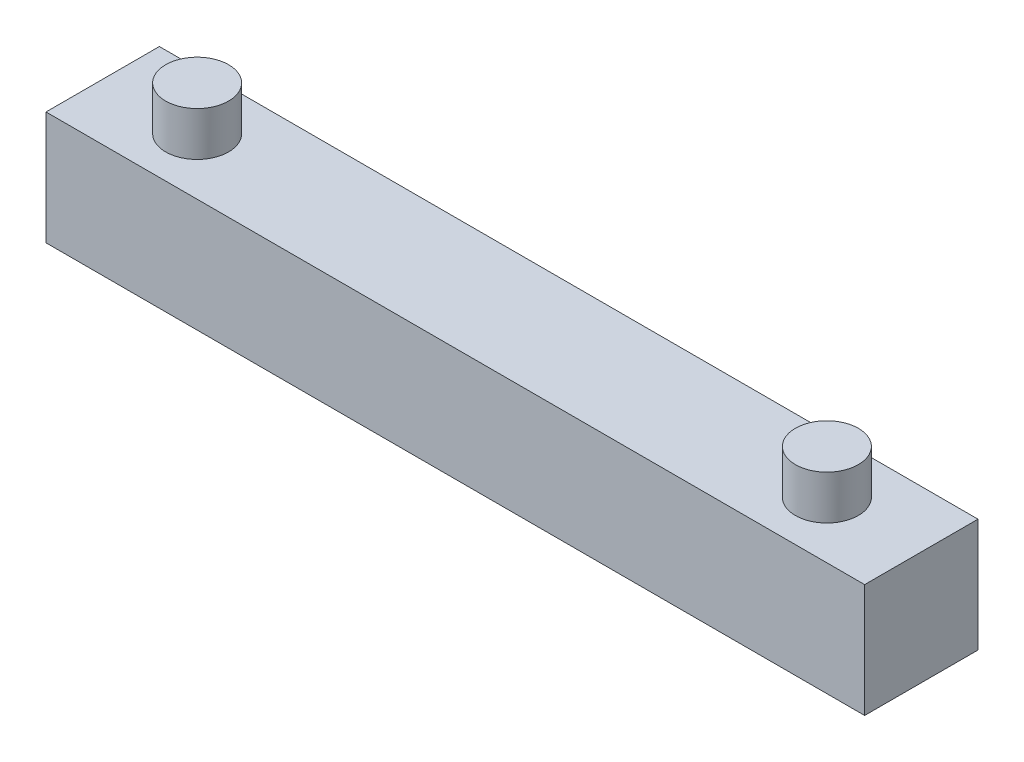
ISO-10303-21;
HEADER;
FILE_DESCRIPTION(('STEP AP214'),'2;1');
FILE_NAME('part.step','',(''),(''),'','','');
FILE_SCHEMA(('AUTOMOTIVE_DESIGN { 1 0 10303 214 1 1 1 1 }'));
ENDSEC;
DATA;
#1=APPLICATION_CONTEXT('core data for automotive mechanical design processes');
#2=APPLICATION_PROTOCOL_DEFINITION('international standard','automotive_design',2000,#1);
#3=PRODUCT_CONTEXT('',#1,'mechanical');
#4=PRODUCT('Part','Part','',(#3));
#5=PRODUCT_RELATED_PRODUCT_CATEGORY('part','',(#4));
#6=PRODUCT_DEFINITION_FORMATION('','',#4);
#7=PRODUCT_DEFINITION_CONTEXT('part definition',#1,'design');
#8=PRODUCT_DEFINITION('design','',#6,#7);
#9=PRODUCT_DEFINITION_SHAPE('','',#8);
#10=(LENGTH_UNIT() NAMED_UNIT(*) SI_UNIT(.MILLI.,.METRE.));
#11=(NAMED_UNIT(*) PLANE_ANGLE_UNIT() SI_UNIT($,.RADIAN.));
#12=(NAMED_UNIT(*) SI_UNIT($,.STERADIAN.) SOLID_ANGLE_UNIT());
#13=UNCERTAINTY_MEASURE_WITH_UNIT(LENGTH_MEASURE(1.E-05),#10,'distance_accuracy_value','');
#14=(GEOMETRIC_REPRESENTATION_CONTEXT(3) GLOBAL_UNCERTAINTY_ASSIGNED_CONTEXT((#13)) GLOBAL_UNIT_ASSIGNED_CONTEXT((#10,
#11,#12)) REPRESENTATION_CONTEXT('',''));
#15=CARTESIAN_POINT('',(0.,0.,0.));
#16=DIRECTION('',(0.,0.,1.));
#17=DIRECTION('',(1.,0.,0.));
#18=AXIS2_PLACEMENT_3D('',#15,#16,#17);
#19=CARTESIAN_POINT('',(32.5,9.,4.5));
#20=DIRECTION('',(-1.,0.,0.));
#21=DIRECTION('',(0.,0.,1.));
#22=AXIS2_PLACEMENT_3D('',#19,#20,#21);
#23=PLANE('',#22);
#24=DIRECTION('',(0.,0.,-1.));
#25=VECTOR('',#24,1.);
#26=CARTESIAN_POINT('',(32.5,0.,4.5));
#27=LINE('',#26,#25);
#28=CARTESIAN_POINT('',(32.5,0.,4.5));
#29=VERTEX_POINT('',#28);
#30=CARTESIAN_POINT('',(32.5,0.,-4.5));
#31=VERTEX_POINT('',#30);
#32=EDGE_CURVE('E106',#29,#31,#27,.T.);
#33=ORIENTED_EDGE('',*,*,#32,.T.);
#34=DIRECTION('',(0.,-1.,0.));
#35=VECTOR('',#34,1.);
#36=CARTESIAN_POINT('',(32.5,9.,-4.5));
#37=LINE('',#36,#35);
#38=CARTESIAN_POINT('',(32.5,9.,-4.5));
#39=VERTEX_POINT('',#38);
#40=EDGE_CURVE('E97',#39,#31,#37,.T.);
#41=ORIENTED_EDGE('',*,*,#40,.F.);
#42=DIRECTION('',(0.,0.,-1.));
#43=VECTOR('',#42,1.);
#44=CARTESIAN_POINT('',(32.5,9.,4.5));
#45=LINE('',#44,#43);
#46=CARTESIAN_POINT('',(32.5,9.,4.5));
#47=VERTEX_POINT('',#46);
#48=EDGE_CURVE('E91',#47,#39,#45,.T.);
#49=ORIENTED_EDGE('',*,*,#48,.F.);
#50=DIRECTION('',(0.,-1.,0.));
#51=VECTOR('',#50,1.);
#52=CARTESIAN_POINT('',(32.5,9.,4.5));
#53=LINE('',#52,#51);
#54=EDGE_CURVE('E102',#47,#29,#53,.T.);
#55=ORIENTED_EDGE('',*,*,#54,.T.);
#56=EDGE_LOOP('',(#33,#41,#49,#55));
#57=FACE_BOUND('',#56,.T.);
#58=ADVANCED_FACE('F39',(#57),#23,.F.);
#59=CARTESIAN_POINT('',(-32.5,9.,-4.5));
#60=DIRECTION('',(0.,0.,1.));
#61=DIRECTION('',(1.,0.,0.));
#62=AXIS2_PLACEMENT_3D('',#59,#60,#61);
#63=PLANE('',#62);
#64=DIRECTION('',(-1.,0.,0.));
#65=VECTOR('',#64,1.);
#66=CARTESIAN_POINT('',(-32.5,0.,-4.5));
#67=LINE('',#66,#65);
#68=CARTESIAN_POINT('',(-32.5,0.,-4.5));
#69=VERTEX_POINT('',#68);
#70=EDGE_CURVE('E96',#31,#69,#67,.T.);
#71=ORIENTED_EDGE('',*,*,#70,.T.);
#72=DIRECTION('',(0.,-1.,0.));
#73=VECTOR('',#72,1.);
#74=CARTESIAN_POINT('',(-32.5,9.,-4.5));
#75=LINE('',#74,#73);
#76=CARTESIAN_POINT('',(-32.5,9.,-4.5));
#77=VERTEX_POINT('',#76);
#78=EDGE_CURVE('E94',#77,#69,#75,.T.);
#79=ORIENTED_EDGE('',*,*,#78,.F.);
#80=DIRECTION('',(-1.,0.,0.));
#81=VECTOR('',#80,1.);
#82=CARTESIAN_POINT('',(-32.5,9.,-4.5));
#83=LINE('',#82,#81);
#84=EDGE_CURVE('E86',#39,#77,#83,.T.);
#85=ORIENTED_EDGE('',*,*,#84,.F.);
#86=ORIENTED_EDGE('',*,*,#40,.T.);
#87=EDGE_LOOP('',(#71,#79,#85,#86));
#88=FACE_BOUND('',#87,.T.);
#89=ADVANCED_FACE('F95',(#88),#63,.F.);
#90=CARTESIAN_POINT('',(-32.5,9.,4.5));
#91=DIRECTION('',(1.,0.,0.));
#92=DIRECTION('',(0.,0.,-1.));
#93=AXIS2_PLACEMENT_3D('',#90,#91,#92);
#94=PLANE('',#93);
#95=DIRECTION('',(0.,0.,1.));
#96=VECTOR('',#95,1.);
#97=CARTESIAN_POINT('',(-32.5,0.,4.5));
#98=LINE('',#97,#96);
#99=CARTESIAN_POINT('',(-32.5,0.,4.5));
#100=VERTEX_POINT('',#99);
#101=EDGE_CURVE('E72',#69,#100,#98,.T.);
#102=ORIENTED_EDGE('',*,*,#101,.T.);
#103=DIRECTION('',(0.,-1.,0.));
#104=VECTOR('',#103,1.);
#105=CARTESIAN_POINT('',(-32.5,9.,4.5));
#106=LINE('',#105,#104);
#107=CARTESIAN_POINT('',(-32.5,9.,4.5));
#108=VERTEX_POINT('',#107);
#109=EDGE_CURVE('E98',#108,#100,#106,.T.);
#110=ORIENTED_EDGE('',*,*,#109,.F.);
#111=DIRECTION('',(0.,0.,1.));
#112=VECTOR('',#111,1.);
#113=CARTESIAN_POINT('',(-32.5,9.,4.5));
#114=LINE('',#113,#112);
#115=EDGE_CURVE('E89',#77,#108,#114,.T.);
#116=ORIENTED_EDGE('',*,*,#115,.F.);
#117=ORIENTED_EDGE('',*,*,#78,.T.);
#118=EDGE_LOOP('',(#102,#110,#116,#117));
#119=FACE_BOUND('',#118,.T.);
#120=ADVANCED_FACE('F100',(#119),#94,.F.);
#121=CARTESIAN_POINT('',(-32.5,9.,4.5));
#122=DIRECTION('',(0.,0.,-1.));
#123=DIRECTION('',(-1.,0.,0.));
#124=AXIS2_PLACEMENT_3D('',#121,#122,#123);
#125=PLANE('',#124);
#126=DIRECTION('',(1.,0.,0.));
#127=VECTOR('',#126,1.);
#128=CARTESIAN_POINT('',(-32.5,0.,4.5));
#129=LINE('',#128,#127);
#130=EDGE_CURVE('E78',#100,#29,#129,.T.);
#131=ORIENTED_EDGE('',*,*,#130,.T.);
#132=ORIENTED_EDGE('',*,*,#54,.F.);
#133=DIRECTION('',(1.,0.,0.));
#134=VECTOR('',#133,1.);
#135=CARTESIAN_POINT('',(-32.5,9.,4.5));
#136=LINE('',#135,#134);
#137=EDGE_CURVE('E55',#108,#47,#136,.T.);
#138=ORIENTED_EDGE('',*,*,#137,.F.);
#139=ORIENTED_EDGE('',*,*,#109,.T.);
#140=EDGE_LOOP('',(#131,#132,#138,#139));
#141=FACE_BOUND('',#140,.T.);
#142=ADVANCED_FACE('F122',(#141),#125,.F.);
#143=CARTESIAN_POINT('',(0.,9.,0.));
#144=DIRECTION('',(0.,-1.,0.));
#145=DIRECTION('',(0.,0.,-1.));
#146=AXIS2_PLACEMENT_3D('',#143,#144,#145);
#147=PLANE('',#146);
#148=CARTESIAN_POINT('',(25.,9.,0.));
#149=DIRECTION('',(0.,-1.,0.));
#150=DIRECTION('',(0.,0.,-1.));
#151=AXIS2_PLACEMENT_3D('',#148,#149,#150);
#152=CIRCLE('',#151,2.5);
#153=CARTESIAN_POINT('',(25.,9.,-2.5));
#154=VERTEX_POINT('',#153);
#155=EDGE_CURVE('E11',#154,#154,#152,.F.);
#156=ORIENTED_EDGE('',*,*,#155,.F.);
#157=EDGE_LOOP('',(#156));
#158=FACE_BOUND('',#157,.T.);
#159=CARTESIAN_POINT('',(-25.,9.,0.));
#160=DIRECTION('',(0.,-1.,0.));
#161=DIRECTION('',(0.,0.,-1.));
#162=AXIS2_PLACEMENT_3D('',#159,#160,#161);
#163=CIRCLE('',#162,2.5);
#164=CARTESIAN_POINT('',(-25.,9.,-2.5));
#165=VERTEX_POINT('',#164);
#166=EDGE_CURVE('E47',#165,#165,#163,.F.);
#167=ORIENTED_EDGE('',*,*,#166,.F.);
#168=EDGE_LOOP('',(#167));
#169=FACE_BOUND('',#168,.T.);
#170=ORIENTED_EDGE('',*,*,#48,.T.);
#171=ORIENTED_EDGE('',*,*,#84,.T.);
#172=ORIENTED_EDGE('',*,*,#115,.T.);
#173=ORIENTED_EDGE('',*,*,#137,.T.);
#174=EDGE_LOOP('',(#170,#171,#172,#173));
#175=FACE_BOUND('',#174,.T.);
#176=ADVANCED_FACE('F87',(#158,#169,#175),#147,.F.);
#177=CARTESIAN_POINT('',(0.,0.,0.));
#178=DIRECTION('',(0.,-1.,0.));
#179=DIRECTION('',(0.,0.,-1.));
#180=AXIS2_PLACEMENT_3D('',#177,#178,#179);
#181=PLANE('',#180);
#182=ORIENTED_EDGE('',*,*,#32,.F.);
#183=ORIENTED_EDGE('',*,*,#130,.F.);
#184=ORIENTED_EDGE('',*,*,#101,.F.);
#185=ORIENTED_EDGE('',*,*,#70,.F.);
#186=EDGE_LOOP('',(#182,#183,#184,#185));
#187=FACE_BOUND('',#186,.T.);
#188=ADVANCED_FACE('F121',(#187),#181,.T.);
#189=CARTESIAN_POINT('',(-25.,12.5,0.));
#190=DIRECTION('',(0.,-1.,0.));
#191=DIRECTION('',(0.,0.,-1.));
#192=AXIS2_PLACEMENT_3D('',#189,#190,#191);
#193=CYLINDRICAL_SURFACE('',#192,2.5);
#194=CARTESIAN_POINT('',(-25.,12.5,0.));
#195=DIRECTION('',(0.,1.,0.));
#196=DIRECTION('',(0.,0.,1.));
#197=AXIS2_PLACEMENT_3D('',#194,#195,#196);
#198=CIRCLE('',#197,2.5);
#199=CARTESIAN_POINT('',(-25.,12.5,2.5));
#200=VERTEX_POINT('',#199);
#201=EDGE_CURVE('E109',#200,#200,#198,.T.);
#202=ORIENTED_EDGE('',*,*,#201,.F.);
#203=EDGE_LOOP('',(#202));
#204=FACE_BOUND('',#203,.T.);
#205=ORIENTED_EDGE('',*,*,#166,.T.);
#206=EDGE_LOOP('',(#205));
#207=FACE_BOUND('',#206,.T.);
#208=ADVANCED_FACE('F118',(#204,#207),#193,.T.);
#209=CARTESIAN_POINT('',(0.,12.5,0.));
#210=DIRECTION('',(0.,1.,0.));
#211=DIRECTION('',(0.,0.,1.));
#212=AXIS2_PLACEMENT_3D('',#209,#210,#211);
#213=PLANE('',#212);
#214=ORIENTED_EDGE('',*,*,#201,.T.);
#215=EDGE_LOOP('',(#214));
#216=FACE_BOUND('',#215,.T.);
#217=ADVANCED_FACE('F152',(#216),#213,.T.);
#218=CARTESIAN_POINT('',(25.,12.5,0.));
#219=DIRECTION('',(0.,-1.,0.));
#220=DIRECTION('',(0.,0.,-1.));
#221=AXIS2_PLACEMENT_3D('',#218,#219,#220);
#222=CYLINDRICAL_SURFACE('',#221,2.5);
#223=CARTESIAN_POINT('',(25.,12.5,0.));
#224=DIRECTION('',(0.,1.,0.));
#225=DIRECTION('',(0.,0.,1.));
#226=AXIS2_PLACEMENT_3D('',#223,#224,#225);
#227=CIRCLE('',#226,2.5);
#228=CARTESIAN_POINT('',(25.,12.5,2.5));
#229=VERTEX_POINT('',#228);
#230=EDGE_CURVE('E143',#229,#229,#227,.T.);
#231=ORIENTED_EDGE('',*,*,#230,.F.);
#232=EDGE_LOOP('',(#231));
#233=FACE_BOUND('',#232,.T.);
#234=ORIENTED_EDGE('',*,*,#155,.T.);
#235=EDGE_LOOP('',(#234));
#236=FACE_BOUND('',#235,.T.);
#237=ADVANCED_FACE('F149',(#233,#236),#222,.T.);
#238=CARTESIAN_POINT('',(0.,12.5,0.));
#239=DIRECTION('',(0.,1.,0.));
#240=DIRECTION('',(0.,0.,1.));
#241=AXIS2_PLACEMENT_3D('',#238,#239,#240);
#242=PLANE('',#241);
#243=ORIENTED_EDGE('',*,*,#230,.T.);
#244=EDGE_LOOP('',(#243));
#245=FACE_BOUND('',#244,.T.);
#246=ADVANCED_FACE('F147',(#245),#242,.T.);
#247=CLOSED_SHELL('',(#58,#89,#120,#142,#176,#188,#208,#217,#237,#246));
#248=MANIFOLD_SOLID_BREP('B2',#247);
#249=ADVANCED_BREP_SHAPE_REPRESENTATION('',(#18,#248),#14);
#250=SHAPE_DEFINITION_REPRESENTATION(#9,#249);
ENDSEC;
END-ISO-10303-21;
